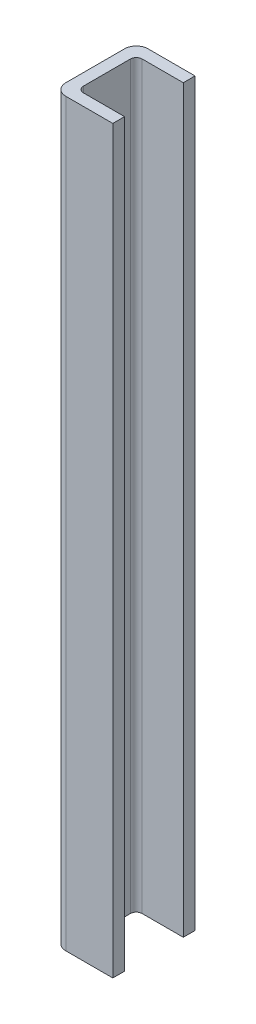
ISO-10303-21;
HEADER;
FILE_DESCRIPTION(('STEP AP214'),'2;1');
FILE_NAME('part.step','',(''),(''),'','','');
FILE_SCHEMA(('AUTOMOTIVE_DESIGN { 1 0 10303 214 1 1 1 1 }'));
ENDSEC;
DATA;
#1=APPLICATION_CONTEXT('core data for automotive mechanical design processes');
#2=APPLICATION_PROTOCOL_DEFINITION('international standard','automotive_design',2000,#1);
#3=PRODUCT_CONTEXT('',#1,'mechanical');
#4=PRODUCT('Part','Part','',(#3));
#5=PRODUCT_RELATED_PRODUCT_CATEGORY('part','',(#4));
#6=PRODUCT_DEFINITION_FORMATION('','',#4);
#7=PRODUCT_DEFINITION_CONTEXT('part definition',#1,'design');
#8=PRODUCT_DEFINITION('design','',#6,#7);
#9=PRODUCT_DEFINITION_SHAPE('','',#8);
#10=(LENGTH_UNIT() NAMED_UNIT(*) SI_UNIT(.MILLI.,.METRE.));
#11=(NAMED_UNIT(*) PLANE_ANGLE_UNIT() SI_UNIT($,.RADIAN.));
#12=(NAMED_UNIT(*) SI_UNIT($,.STERADIAN.) SOLID_ANGLE_UNIT());
#13=UNCERTAINTY_MEASURE_WITH_UNIT(LENGTH_MEASURE(1.E-05),#10,'distance_accuracy_value','');
#14=(GEOMETRIC_REPRESENTATION_CONTEXT(3) GLOBAL_UNCERTAINTY_ASSIGNED_CONTEXT((#13)) GLOBAL_UNIT_ASSIGNED_CONTEXT((#10,
#11,#12)) REPRESENTATION_CONTEXT('',''));
#15=CARTESIAN_POINT('',(0.,0.,0.));
#16=DIRECTION('',(0.,0.,1.));
#17=DIRECTION('',(1.,0.,0.));
#18=AXIS2_PLACEMENT_3D('',#15,#16,#17);
#19=CARTESIAN_POINT('',(-1.4,3.15,0.6));
#20=DIRECTION('',(0.,0.,1.));
#21=DIRECTION('',(1.,0.,0.));
#22=AXIS2_PLACEMENT_3D('',#19,#20,#21);
#23=PLANE('',#22);
#24=DIRECTION('',(1.,0.,0.));
#25=VECTOR('',#24,1.);
#26=CARTESIAN_POINT('',(-1.475,-3.15,0.6));
#27=LINE('',#26,#25);
#28=CARTESIAN_POINT('',(-1.4,-3.15,0.6));
#29=VERTEX_POINT('',#28);
#30=CARTESIAN_POINT('',(-1.05,-3.15,0.6));
#31=VERTEX_POINT('',#30);
#32=EDGE_CURVE('E11',#29,#31,#27,.T.);
#33=ORIENTED_EDGE('',*,*,#32,.F.);
#34=DIRECTION('',(0.,-1.,0.));
#35=VECTOR('',#34,1.);
#36=CARTESIAN_POINT('',(-1.4,3.15,0.6));
#37=LINE('',#36,#35);
#38=CARTESIAN_POINT('',(-1.4,3.15,0.6));
#39=VERTEX_POINT('',#38);
#40=EDGE_CURVE('E24',#39,#29,#37,.T.);
#41=ORIENTED_EDGE('',*,*,#40,.F.);
#42=DIRECTION('',(-1.,0.,0.));
#43=VECTOR('',#42,1.);
#44=CARTESIAN_POINT('',(0.0750000000000002,3.15,0.6));
#45=LINE('',#44,#43);
#46=CARTESIAN_POINT('',(-1.05,3.15,0.6));
#47=VERTEX_POINT('',#46);
#48=EDGE_CURVE('E199',#47,#39,#45,.T.);
#49=ORIENTED_EDGE('',*,*,#48,.F.);
#50=DIRECTION('',(0.,1.,0.));
#51=VECTOR('',#50,1.);
#52=CARTESIAN_POINT('',(-1.05,-3.834209469942,0.6));
#53=LINE('',#52,#51);
#54=EDGE_CURVE('E196',#31,#47,#53,.T.);
#55=ORIENTED_EDGE('',*,*,#54,.F.);
#56=EDGE_LOOP('',(#33,#41,#49,#55));
#57=FACE_BOUND('',#56,.T.);
#58=ADVANCED_FACE('F17',(#57),#23,.F.);
#59=CARTESIAN_POINT('',(1.4,3.15,0.1));
#60=DIRECTION('',(0.,0.,-1.));
#61=DIRECTION('',(-1.,0.,0.));
#62=AXIS2_PLACEMENT_3D('',#59,#60,#61);
#63=PLANE('',#62);
#64=DIRECTION('',(-1.,0.,0.));
#65=VECTOR('',#64,1.);
#66=CARTESIAN_POINT('',(-0.0749999999999996,-3.15,0.1));
#67=LINE('',#66,#65);
#68=CARTESIAN_POINT('',(-1.05,-3.15,0.1));
#69=VERTEX_POINT('',#68);
#70=CARTESIAN_POINT('',(-1.4,-3.15,0.1));
#71=VERTEX_POINT('',#70);
#72=EDGE_CURVE('E194',#69,#71,#67,.T.);
#73=ORIENTED_EDGE('',*,*,#72,.F.);
#74=DIRECTION('',(0.,-1.,0.));
#75=VECTOR('',#74,1.);
#76=CARTESIAN_POINT('',(-1.05,3.15,0.1));
#77=LINE('',#76,#75);
#78=CARTESIAN_POINT('',(-1.05,3.15,0.1));
#79=VERTEX_POINT('',#78);
#80=EDGE_CURVE('E191',#79,#69,#77,.T.);
#81=ORIENTED_EDGE('',*,*,#80,.F.);
#82=DIRECTION('',(1.,0.,0.));
#83=VECTOR('',#82,1.);
#84=CARTESIAN_POINT('',(1.475,3.15,0.1));
#85=LINE('',#84,#83);
#86=CARTESIAN_POINT('',(-1.4,3.15,0.1));
#87=VERTEX_POINT('',#86);
#88=EDGE_CURVE('E188',#87,#79,#85,.T.);
#89=ORIENTED_EDGE('',*,*,#88,.F.);
#90=DIRECTION('',(0.,-1.,0.));
#91=VECTOR('',#90,1.);
#92=CARTESIAN_POINT('',(-1.4,3.15,0.1));
#93=LINE('',#92,#91);
#94=EDGE_CURVE('E185',#87,#71,#93,.T.);
#95=ORIENTED_EDGE('',*,*,#94,.T.);
#96=EDGE_LOOP('',(#73,#81,#89,#95));
#97=FACE_BOUND('',#96,.T.);
#98=ADVANCED_FACE('F235',(#97),#63,.F.);
#99=CARTESIAN_POINT('',(-1.4,3.15,0.55));
#100=DIRECTION('',(0.,1.,0.));
#101=DIRECTION('',(1.,0.,0.));
#102=AXIS2_PLACEMENT_3D('',#99,#100,#101);
#103=CYLINDRICAL_SURFACE('',#102,0.05);
#104=CARTESIAN_POINT('',(-1.4,-3.15,0.55));
#105=DIRECTION('',(0.,1.,0.));
#106=DIRECTION('',(1.,0.,0.));
#107=AXIS2_PLACEMENT_3D('',#104,#105,#106);
#108=CIRCLE('',#107,0.05);
#109=CARTESIAN_POINT('',(-1.45,-3.15,0.55));
#110=VERTEX_POINT('',#109);
#111=EDGE_CURVE('E183',#110,#29,#108,.T.);
#112=ORIENTED_EDGE('',*,*,#111,.F.);
#113=DIRECTION('',(0.,-1.,0.));
#114=VECTOR('',#113,1.);
#115=CARTESIAN_POINT('',(-1.45,3.15,0.55));
#116=LINE('',#115,#114);
#117=CARTESIAN_POINT('',(-1.45,3.15,0.55));
#118=VERTEX_POINT('',#117);
#119=EDGE_CURVE('E181',#118,#110,#116,.T.);
#120=ORIENTED_EDGE('',*,*,#119,.F.);
#121=CARTESIAN_POINT('',(-1.4,3.15,0.55));
#122=DIRECTION('',(0.,-1.,0.));
#123=DIRECTION('',(1.,0.,0.));
#124=AXIS2_PLACEMENT_3D('',#121,#122,#123);
#125=CIRCLE('',#124,0.05);
#126=EDGE_CURVE('E179',#39,#118,#125,.T.);
#127=ORIENTED_EDGE('',*,*,#126,.F.);
#128=ORIENTED_EDGE('',*,*,#40,.T.);
#129=EDGE_LOOP('',(#112,#120,#127,#128));
#130=FACE_BOUND('',#129,.T.);
#131=ADVANCED_FACE('F204',(#130),#103,.F.);
#132=CARTESIAN_POINT('',(-1.45,3.15,0.15));
#133=DIRECTION('',(-1.,0.,0.));
#134=DIRECTION('',(0.,0.,1.));
#135=AXIS2_PLACEMENT_3D('',#132,#133,#134);
#136=PLANE('',#135);
#137=DIRECTION('',(0.,0.,1.));
#138=VECTOR('',#137,1.);
#139=CARTESIAN_POINT('',(-1.45,-3.15,0.075));
#140=LINE('',#139,#138);
#141=CARTESIAN_POINT('',(-1.45,-3.15,0.15));
#142=VERTEX_POINT('',#141);
#143=EDGE_CURVE('E176',#142,#110,#140,.T.);
#144=ORIENTED_EDGE('',*,*,#143,.F.);
#145=DIRECTION('',(0.,-1.,0.));
#146=VECTOR('',#145,1.);
#147=CARTESIAN_POINT('',(-1.45,3.15,0.15));
#148=LINE('',#147,#146);
#149=CARTESIAN_POINT('',(-1.45,3.15,0.15));
#150=VERTEX_POINT('',#149);
#151=EDGE_CURVE('E173',#150,#142,#148,.T.);
#152=ORIENTED_EDGE('',*,*,#151,.F.);
#153=DIRECTION('',(0.,0.,-1.));
#154=VECTOR('',#153,1.);
#155=CARTESIAN_POINT('',(-1.45,3.15,0.075));
#156=LINE('',#155,#154);
#157=EDGE_CURVE('E170',#118,#150,#156,.T.);
#158=ORIENTED_EDGE('',*,*,#157,.F.);
#159=ORIENTED_EDGE('',*,*,#119,.T.);
#160=EDGE_LOOP('',(#144,#152,#158,#159));
#161=FACE_BOUND('',#160,.T.);
#162=ADVANCED_FACE('F208',(#161),#136,.F.);
#163=CARTESIAN_POINT('',(-1.4,3.15,0.15));
#164=DIRECTION('',(0.,1.,0.));
#165=DIRECTION('',(0.,0.,1.));
#166=AXIS2_PLACEMENT_3D('',#163,#164,#165);
#167=CYLINDRICAL_SURFACE('',#166,0.05);
#168=CARTESIAN_POINT('',(-1.4,-3.15,0.15));
#169=DIRECTION('',(0.,1.,0.));
#170=DIRECTION('',(0.,0.,1.));
#171=AXIS2_PLACEMENT_3D('',#168,#169,#170);
#172=CIRCLE('',#171,0.05);
#173=EDGE_CURVE('E167',#71,#142,#172,.T.);
#174=ORIENTED_EDGE('',*,*,#173,.F.);
#175=ORIENTED_EDGE('',*,*,#94,.F.);
#176=CARTESIAN_POINT('',(-1.4,3.15,0.15));
#177=DIRECTION('',(0.,-1.,0.));
#178=DIRECTION('',(0.,0.,1.));
#179=AXIS2_PLACEMENT_3D('',#176,#177,#178);
#180=CIRCLE('',#179,0.05);
#181=EDGE_CURVE('E164',#150,#87,#180,.T.);
#182=ORIENTED_EDGE('',*,*,#181,.F.);
#183=ORIENTED_EDGE('',*,*,#151,.T.);
#184=EDGE_LOOP('',(#174,#175,#182,#183));
#185=FACE_BOUND('',#184,.T.);
#186=ADVANCED_FACE('F212',(#185),#167,.F.);
#187=CARTESIAN_POINT('',(1.55,3.15,0.));
#188=DIRECTION('',(0.,1.,0.));
#189=DIRECTION('',(-1.,0.,0.));
#190=AXIS2_PLACEMENT_3D('',#187,#188,#189);
#191=PLANE('',#190);
#192=ORIENTED_EDGE('',*,*,#48,.T.);
#193=ORIENTED_EDGE('',*,*,#126,.T.);
#194=ORIENTED_EDGE('',*,*,#157,.T.);
#195=ORIENTED_EDGE('',*,*,#181,.T.);
#196=ORIENTED_EDGE('',*,*,#88,.T.);
#197=DIRECTION('',(0.,0.,-1.));
#198=VECTOR('',#197,1.);
#199=CARTESIAN_POINT('',(-1.05,3.15,0.));
#200=LINE('',#199,#198);
#201=CARTESIAN_POINT('',(-1.05,3.15,0.));
#202=VERTEX_POINT('',#201);
#203=EDGE_CURVE('E162',#79,#202,#200,.T.);
#204=ORIENTED_EDGE('',*,*,#203,.T.);
#205=DIRECTION('',(-1.,0.,0.));
#206=VECTOR('',#205,1.);
#207=CARTESIAN_POINT('',(1.55,3.15,0.));
#208=LINE('',#207,#206);
#209=CARTESIAN_POINT('',(-1.45,3.15,0.));
#210=VERTEX_POINT('',#209);
#211=EDGE_CURVE('E160',#202,#210,#208,.T.);
#212=ORIENTED_EDGE('',*,*,#211,.T.);
#213=CARTESIAN_POINT('',(-1.45,3.15,0.1));
#214=DIRECTION('',(0.,-1.,0.));
#215=DIRECTION('',(-0.707106781186548,0.,-0.707106781186547));
#216=AXIS2_PLACEMENT_3D('',#213,#214,#215);
#217=CIRCLE('',#216,0.1);
#218=CARTESIAN_POINT('',(-1.55,3.15,0.1));
#219=VERTEX_POINT('',#218);
#220=EDGE_CURVE('E157',#219,#210,#217,.T.);
#221=ORIENTED_EDGE('',*,*,#220,.F.);
#222=DIRECTION('',(0.,0.,1.));
#223=VECTOR('',#222,1.);
#224=CARTESIAN_POINT('',(-1.55,3.15,0.));
#225=LINE('',#224,#223);
#226=CARTESIAN_POINT('',(-1.55,3.15,0.6));
#227=VERTEX_POINT('',#226);
#228=EDGE_CURVE('E155',#219,#227,#225,.T.);
#229=ORIENTED_EDGE('',*,*,#228,.T.);
#230=CARTESIAN_POINT('',(-1.45,3.15,0.6));
#231=DIRECTION('',(0.,-1.,0.));
#232=DIRECTION('',(-0.707106781186548,0.,0.707106781186547));
#233=AXIS2_PLACEMENT_3D('',#230,#231,#232);
#234=CIRCLE('',#233,0.1);
#235=CARTESIAN_POINT('',(-1.45,3.15,0.7));
#236=VERTEX_POINT('',#235);
#237=EDGE_CURVE('E117',#236,#227,#234,.T.);
#238=ORIENTED_EDGE('',*,*,#237,.F.);
#239=DIRECTION('',(-1.,0.,0.));
#240=VECTOR('',#239,1.);
#241=CARTESIAN_POINT('',(1.55,3.15,0.7));
#242=LINE('',#241,#240);
#243=CARTESIAN_POINT('',(-1.05,3.15,0.7));
#244=VERTEX_POINT('',#243);
#245=EDGE_CURVE('E151',#244,#236,#242,.T.);
#246=ORIENTED_EDGE('',*,*,#245,.F.);
#247=DIRECTION('',(0.,0.,-1.));
#248=VECTOR('',#247,1.);
#249=CARTESIAN_POINT('',(-1.05,3.15,0.35));
#250=LINE('',#249,#248);
#251=EDGE_CURVE('E148',#244,#47,#250,.T.);
#252=ORIENTED_EDGE('',*,*,#251,.T.);
#253=EDGE_LOOP('',(#192,#193,#194,#195,#196,#204,#212,#221,#229,#238,#246,#252));
#254=FACE_BOUND('',#253,.T.);
#255=ADVANCED_FACE('F215',(#254),#191,.T.);
#256=CARTESIAN_POINT('',(-1.05,3.15,0.));
#257=DIRECTION('',(-1.,0.,0.));
#258=DIRECTION('',(0.,-1.,0.));
#259=AXIS2_PLACEMENT_3D('',#256,#257,#258);
#260=PLANE('',#259);
#261=DIRECTION('',(0.,-1.,0.));
#262=VECTOR('',#261,1.);
#263=CARTESIAN_POINT('',(-1.05,1.575,0.));
#264=LINE('',#263,#262);
#265=CARTESIAN_POINT('',(-1.05,-3.15,0.));
#266=VERTEX_POINT('',#265);
#267=EDGE_CURVE('E146',#202,#266,#264,.T.);
#268=ORIENTED_EDGE('',*,*,#267,.F.);
#269=ORIENTED_EDGE('',*,*,#203,.F.);
#270=ORIENTED_EDGE('',*,*,#80,.T.);
#271=DIRECTION('',(0.,0.,1.));
#272=VECTOR('',#271,1.);
#273=CARTESIAN_POINT('',(-1.05,-3.15,0.));
#274=LINE('',#273,#272);
#275=EDGE_CURVE('E143',#266,#69,#274,.T.);
#276=ORIENTED_EDGE('',*,*,#275,.F.);
#277=EDGE_LOOP('',(#268,#269,#270,#276));
#278=FACE_BOUND('',#277,.T.);
#279=ADVANCED_FACE('F233',(#278),#260,.F.);
#280=CARTESIAN_POINT('',(0.,0.,0.));
#281=DIRECTION('',(0.,0.,1.));
#282=DIRECTION('',(1.,0.,0.));
#283=AXIS2_PLACEMENT_3D('',#280,#281,#282);
#284=PLANE('',#283);
#285=ORIENTED_EDGE('',*,*,#267,.T.);
#286=DIRECTION('',(1.,0.,0.));
#287=VECTOR('',#286,1.);
#288=CARTESIAN_POINT('',(-1.55,-3.15,0.));
#289=LINE('',#288,#287);
#290=CARTESIAN_POINT('',(-1.45,-3.15,0.));
#291=VERTEX_POINT('',#290);
#292=EDGE_CURVE('E140',#291,#266,#289,.T.);
#293=ORIENTED_EDGE('',*,*,#292,.F.);
#294=DIRECTION('',(0.,-1.,0.));
#295=VECTOR('',#294,1.);
#296=CARTESIAN_POINT('',(-1.45,1.575,0.));
#297=LINE('',#296,#295);
#298=EDGE_CURVE('E137',#210,#291,#297,.T.);
#299=ORIENTED_EDGE('',*,*,#298,.F.);
#300=ORIENTED_EDGE('',*,*,#211,.F.);
#301=EDGE_LOOP('',(#285,#293,#299,#300));
#302=FACE_BOUND('',#301,.T.);
#303=ADVANCED_FACE('F229',(#302),#284,.F.);
#304=CARTESIAN_POINT('',(-1.05,-3.834209469942,0.7));
#305=DIRECTION('',(-1.,0.,0.));
#306=DIRECTION('',(0.,1.,0.));
#307=AXIS2_PLACEMENT_3D('',#304,#305,#306);
#308=PLANE('',#307);
#309=DIRECTION('',(0.,0.,1.));
#310=VECTOR('',#309,1.);
#311=CARTESIAN_POINT('',(-1.05,-3.15,0.35));
#312=LINE('',#311,#310);
#313=CARTESIAN_POINT('',(-1.05,-3.15,0.7));
#314=VERTEX_POINT('',#313);
#315=EDGE_CURVE('E135',#31,#314,#312,.T.);
#316=ORIENTED_EDGE('',*,*,#315,.F.);
#317=ORIENTED_EDGE('',*,*,#54,.T.);
#318=ORIENTED_EDGE('',*,*,#251,.F.);
#319=DIRECTION('',(0.,1.,0.));
#320=VECTOR('',#319,1.);
#321=CARTESIAN_POINT('',(-1.05,-1.917104734971,0.7));
#322=LINE('',#321,#320);
#323=EDGE_CURVE('E132',#314,#244,#322,.T.);
#324=ORIENTED_EDGE('',*,*,#323,.F.);
#325=EDGE_LOOP('',(#316,#317,#318,#324));
#326=FACE_BOUND('',#325,.T.);
#327=ADVANCED_FACE('F220',(#326),#308,.F.);
#328=CARTESIAN_POINT('',(0.,0.,0.7));
#329=DIRECTION('',(0.,0.,1.));
#330=DIRECTION('',(1.,0.,0.));
#331=AXIS2_PLACEMENT_3D('',#328,#329,#330);
#332=PLANE('',#331);
#333=ORIENTED_EDGE('',*,*,#323,.T.);
#334=ORIENTED_EDGE('',*,*,#245,.T.);
#335=DIRECTION('',(0.,1.,0.));
#336=VECTOR('',#335,1.);
#337=CARTESIAN_POINT('',(-1.45,1.575,0.7));
#338=LINE('',#337,#336);
#339=CARTESIAN_POINT('',(-1.45,-3.15,0.7));
#340=VERTEX_POINT('',#339);
#341=EDGE_CURVE('E130',#340,#236,#338,.T.);
#342=ORIENTED_EDGE('',*,*,#341,.F.);
#343=DIRECTION('',(1.,0.,0.));
#344=VECTOR('',#343,1.);
#345=CARTESIAN_POINT('',(-1.55,-3.15,0.7));
#346=LINE('',#345,#344);
#347=EDGE_CURVE('E108',#340,#314,#346,.T.);
#348=ORIENTED_EDGE('',*,*,#347,.T.);
#349=EDGE_LOOP('',(#333,#334,#342,#348));
#350=FACE_BOUND('',#349,.T.);
#351=ADVANCED_FACE('F223',(#350),#332,.T.);
#352=CARTESIAN_POINT('',(-1.45,1.575,0.1));
#353=DIRECTION('',(0.,-1.,0.));
#354=DIRECTION('',(-0.707106781186548,0.,-0.707106781186547));
#355=AXIS2_PLACEMENT_3D('',#352,#353,#354);
#356=CYLINDRICAL_SURFACE('',#355,0.1);
#357=CARTESIAN_POINT('',(-1.45,-3.15,0.1));
#358=DIRECTION('',(0.,1.,0.));
#359=DIRECTION('',(-0.707106781186548,0.,-0.707106781186547));
#360=AXIS2_PLACEMENT_3D('',#357,#358,#359);
#361=CIRCLE('',#360,0.1);
#362=CARTESIAN_POINT('',(-1.55,-3.15,0.1));
#363=VERTEX_POINT('',#362);
#364=EDGE_CURVE('E127',#291,#363,#361,.T.);
#365=ORIENTED_EDGE('',*,*,#364,.T.);
#366=DIRECTION('',(0.,1.,0.));
#367=VECTOR('',#366,1.);
#368=CARTESIAN_POINT('',(-1.55,1.575,0.1));
#369=LINE('',#368,#367);
#370=EDGE_CURVE('E111',#363,#219,#369,.T.);
#371=ORIENTED_EDGE('',*,*,#370,.T.);
#372=ORIENTED_EDGE('',*,*,#220,.T.);
#373=ORIENTED_EDGE('',*,*,#298,.T.);
#374=EDGE_LOOP('',(#365,#371,#372,#373));
#375=FACE_BOUND('',#374,.T.);
#376=ADVANCED_FACE('F225',(#375),#356,.T.);
#377=CARTESIAN_POINT('',(-1.45,1.575,0.6));
#378=DIRECTION('',(0.,-1.,0.));
#379=DIRECTION('',(-0.707106781186548,0.,0.707106781186547));
#380=AXIS2_PLACEMENT_3D('',#377,#378,#379);
#381=CYLINDRICAL_SURFACE('',#380,0.1);
#382=CARTESIAN_POINT('',(-1.45,-3.15,0.6));
#383=DIRECTION('',(0.,1.,0.));
#384=DIRECTION('',(-0.707106781186548,0.,0.707106781186547));
#385=AXIS2_PLACEMENT_3D('',#382,#383,#384);
#386=CIRCLE('',#385,0.1);
#387=CARTESIAN_POINT('',(-1.55,-3.15,0.6));
#388=VERTEX_POINT('',#387);
#389=EDGE_CURVE('E101',#388,#340,#386,.T.);
#390=ORIENTED_EDGE('',*,*,#389,.T.);
#391=ORIENTED_EDGE('',*,*,#341,.T.);
#392=ORIENTED_EDGE('',*,*,#237,.T.);
#393=DIRECTION('',(0.,-1.,0.));
#394=VECTOR('',#393,1.);
#395=CARTESIAN_POINT('',(-1.55,1.575,0.6));
#396=LINE('',#395,#394);
#397=EDGE_CURVE('E112',#227,#388,#396,.T.);
#398=ORIENTED_EDGE('',*,*,#397,.T.);
#399=EDGE_LOOP('',(#390,#391,#392,#398));
#400=FACE_BOUND('',#399,.T.);
#401=ADVANCED_FACE('F116',(#400),#381,.T.);
#402=CARTESIAN_POINT('',(-1.55,-3.15,0.));
#403=DIRECTION('',(0.,-1.,0.));
#404=DIRECTION('',(1.,0.,0.));
#405=AXIS2_PLACEMENT_3D('',#402,#403,#404);
#406=PLANE('',#405);
#407=ORIENTED_EDGE('',*,*,#32,.T.);
#408=ORIENTED_EDGE('',*,*,#315,.T.);
#409=ORIENTED_EDGE('',*,*,#347,.F.);
#410=ORIENTED_EDGE('',*,*,#389,.F.);
#411=DIRECTION('',(0.,0.,1.));
#412=VECTOR('',#411,1.);
#413=CARTESIAN_POINT('',(-1.55,-3.15,0.));
#414=LINE('',#413,#412);
#415=EDGE_CURVE('E106',#363,#388,#414,.T.);
#416=ORIENTED_EDGE('',*,*,#415,.F.);
#417=ORIENTED_EDGE('',*,*,#364,.F.);
#418=ORIENTED_EDGE('',*,*,#292,.T.);
#419=ORIENTED_EDGE('',*,*,#275,.T.);
#420=ORIENTED_EDGE('',*,*,#72,.T.);
#421=ORIENTED_EDGE('',*,*,#173,.T.);
#422=ORIENTED_EDGE('',*,*,#143,.T.);
#423=ORIENTED_EDGE('',*,*,#111,.T.);
#424=EDGE_LOOP('',(#407,#408,#409,#410,#416,#417,#418,#419,#420,#421,#422,#423));
#425=FACE_BOUND('',#424,.T.);
#426=ADVANCED_FACE('F103',(#425),#406,.T.);
#427=CARTESIAN_POINT('',(-1.55,3.15,0.));
#428=DIRECTION('',(-1.,0.,0.));
#429=DIRECTION('',(0.,-1.,0.));
#430=AXIS2_PLACEMENT_3D('',#427,#428,#429);
#431=PLANE('',#430);
#432=ORIENTED_EDGE('',*,*,#370,.F.);
#433=ORIENTED_EDGE('',*,*,#415,.T.);
#434=ORIENTED_EDGE('',*,*,#397,.F.);
#435=ORIENTED_EDGE('',*,*,#228,.F.);
#436=EDGE_LOOP('',(#432,#433,#434,#435));
#437=FACE_BOUND('',#436,.T.);
#438=ADVANCED_FACE('F122',(#437),#431,.T.);
#439=CLOSED_SHELL('',(#58,#98,#131,#162,#186,#255,#279,#303,#327,#351,#376,#401,#426,#438));
#440=MANIFOLD_SOLID_BREP('B1',#439);
#441=ADVANCED_BREP_SHAPE_REPRESENTATION('',(#18,#440),#14);
#442=SHAPE_DEFINITION_REPRESENTATION(#9,#441);
ENDSEC;
END-ISO-10303-21;
